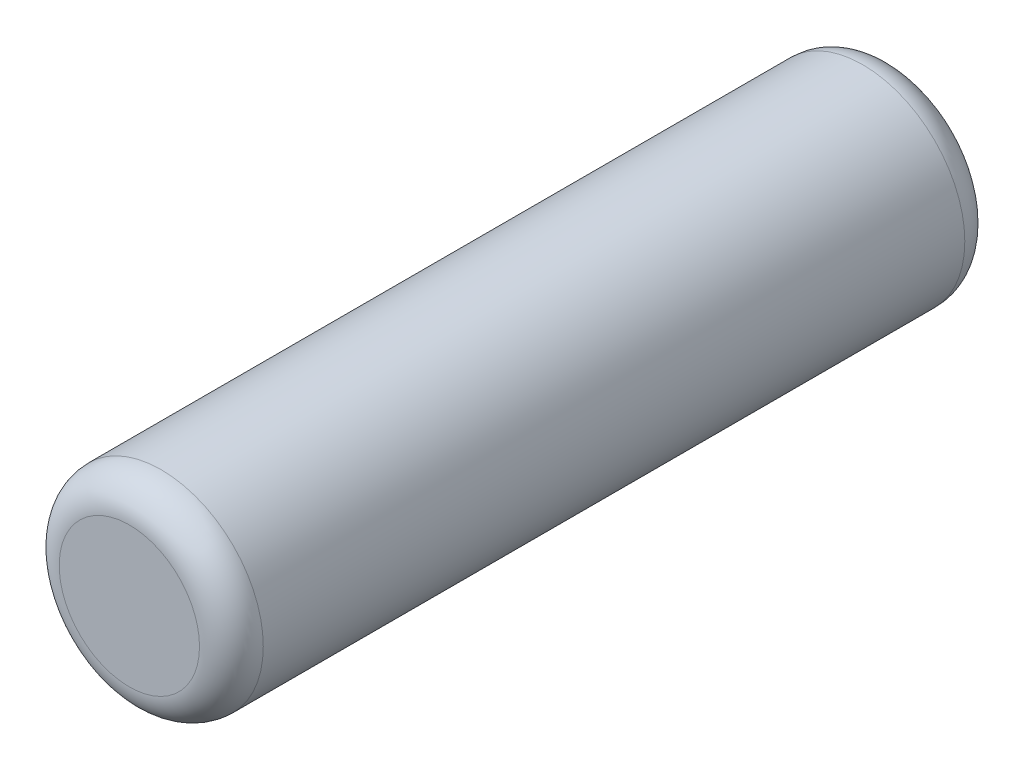
ISO-10303-21;
HEADER;
FILE_DESCRIPTION(('STEP AP214'),'2;1');
FILE_NAME('part.step','',(''),(''),'','','');
FILE_SCHEMA(('AUTOMOTIVE_DESIGN { 1 0 10303 214 1 1 1 1 }'));
ENDSEC;
DATA;
#1=APPLICATION_CONTEXT('core data for automotive mechanical design processes');
#2=APPLICATION_PROTOCOL_DEFINITION('international standard','automotive_design',2000,#1);
#3=PRODUCT_CONTEXT('',#1,'mechanical');
#4=PRODUCT('Part','Part','',(#3));
#5=PRODUCT_RELATED_PRODUCT_CATEGORY('part','',(#4));
#6=PRODUCT_DEFINITION_FORMATION('','',#4);
#7=PRODUCT_DEFINITION_CONTEXT('part definition',#1,'design');
#8=PRODUCT_DEFINITION('design','',#6,#7);
#9=PRODUCT_DEFINITION_SHAPE('','',#8);
#10=(LENGTH_UNIT() NAMED_UNIT(*) SI_UNIT(.MILLI.,.METRE.));
#11=(NAMED_UNIT(*) PLANE_ANGLE_UNIT() SI_UNIT($,.RADIAN.));
#12=(NAMED_UNIT(*) SI_UNIT($,.STERADIAN.) SOLID_ANGLE_UNIT());
#13=UNCERTAINTY_MEASURE_WITH_UNIT(LENGTH_MEASURE(1.E-05),#10,'distance_accuracy_value','');
#14=(GEOMETRIC_REPRESENTATION_CONTEXT(3) GLOBAL_UNCERTAINTY_ASSIGNED_CONTEXT((#13)) GLOBAL_UNIT_ASSIGNED_CONTEXT((#10,
#11,#12)) REPRESENTATION_CONTEXT('',''));
#15=CARTESIAN_POINT('',(0.,0.,0.));
#16=DIRECTION('',(0.,0.,1.));
#17=DIRECTION('',(1.,0.,0.));
#18=AXIS2_PLACEMENT_3D('',#15,#16,#17);
#19=CARTESIAN_POINT('',(0.,0.,24.));
#20=DIRECTION('',(0.,0.,-1.));
#21=DIRECTION('',(-1.,0.,0.));
#22=AXIS2_PLACEMENT_3D('',#19,#20,#21);
#23=CYLINDRICAL_SURFACE('',#22,3.2);
#24=CARTESIAN_POINT('',(0.,0.,1.));
#25=DIRECTION('',(0.,0.,1.));
#26=DIRECTION('',(1.,0.,0.));
#27=AXIS2_PLACEMENT_3D('',#24,#25,#26);
#28=CIRCLE('',#27,3.2);
#29=CARTESIAN_POINT('',(3.2,0.,1.));
#30=VERTEX_POINT('',#29);
#31=EDGE_CURVE('E42',#30,#30,#28,.T.);
#32=ORIENTED_EDGE('',*,*,#31,.T.);
#33=EDGE_LOOP('',(#32));
#34=FACE_BOUND('',#33,.T.);
#35=CARTESIAN_POINT('',(0.,0.,23.));
#36=DIRECTION('',(0.,0.,1.));
#37=DIRECTION('',(1.,0.,0.));
#38=AXIS2_PLACEMENT_3D('',#35,#36,#37);
#39=CIRCLE('',#38,3.2);
#40=CARTESIAN_POINT('',(3.2,0.,23.));
#41=VERTEX_POINT('',#40);
#42=EDGE_CURVE('E46',#41,#41,#39,.F.);
#43=ORIENTED_EDGE('',*,*,#42,.T.);
#44=EDGE_LOOP('',(#43));
#45=FACE_BOUND('',#44,.T.);
#46=ADVANCED_FACE('F31',(#34,#45),#23,.T.);
#47=CARTESIAN_POINT('',(0.,0.,24.));
#48=DIRECTION('',(0.,0.,1.));
#49=DIRECTION('',(1.,0.,0.));
#50=AXIS2_PLACEMENT_3D('',#47,#48,#49);
#51=PLANE('',#50);
#52=CARTESIAN_POINT('',(0.,0.,24.));
#53=DIRECTION('',(0.,0.,1.));
#54=DIRECTION('',(1.,0.,0.));
#55=AXIS2_PLACEMENT_3D('',#52,#53,#54);
#56=CIRCLE('',#55,2.2);
#57=CARTESIAN_POINT('',(2.2,0.,24.));
#58=VERTEX_POINT('',#57);
#59=EDGE_CURVE('E10',#58,#58,#56,.T.);
#60=ORIENTED_EDGE('',*,*,#59,.T.);
#61=EDGE_LOOP('',(#60));
#62=FACE_BOUND('',#61,.T.);
#63=ADVANCED_FACE('F62',(#62),#51,.T.);
#64=CARTESIAN_POINT('',(0.,0.,0.));
#65=DIRECTION('',(0.,0.,1.));
#66=DIRECTION('',(1.,0.,0.));
#67=AXIS2_PLACEMENT_3D('',#64,#65,#66);
#68=PLANE('',#67);
#69=CARTESIAN_POINT('',(0.,0.,0.));
#70=DIRECTION('',(0.,0.,1.));
#71=DIRECTION('',(1.,0.,0.));
#72=AXIS2_PLACEMENT_3D('',#69,#70,#71);
#73=CIRCLE('',#72,2.2);
#74=CARTESIAN_POINT('',(2.2,0.,0.));
#75=VERTEX_POINT('',#74);
#76=EDGE_CURVE('E38',#75,#75,#73,.F.);
#77=ORIENTED_EDGE('',*,*,#76,.T.);
#78=EDGE_LOOP('',(#77));
#79=FACE_BOUND('',#78,.T.);
#80=ADVANCED_FACE('F59',(#79),#68,.F.);
#81=CARTESIAN_POINT('',(0.,0.,1.));
#82=DIRECTION('',(0.,0.,1.));
#83=DIRECTION('',(1.,0.,0.));
#84=AXIS2_PLACEMENT_3D('',#81,#82,#83);
#85=TOROIDAL_SURFACE('',#84,2.2,1.);
#86=ORIENTED_EDGE('',*,*,#76,.F.);
#87=EDGE_LOOP('',(#86));
#88=FACE_BOUND('',#87,.T.);
#89=ORIENTED_EDGE('',*,*,#31,.F.);
#90=EDGE_LOOP('',(#89));
#91=FACE_BOUND('',#90,.T.);
#92=ADVANCED_FACE('F55',(#88,#91),#85,.T.);
#93=CARTESIAN_POINT('',(0.,0.,23.));
#94=DIRECTION('',(0.,0.,1.));
#95=DIRECTION('',(1.,0.,0.));
#96=AXIS2_PLACEMENT_3D('',#93,#94,#95);
#97=TOROIDAL_SURFACE('',#96,2.2,1.);
#98=ORIENTED_EDGE('',*,*,#42,.F.);
#99=EDGE_LOOP('',(#98));
#100=FACE_BOUND('',#99,.T.);
#101=ORIENTED_EDGE('',*,*,#59,.F.);
#102=EDGE_LOOP('',(#101));
#103=FACE_BOUND('',#102,.T.);
#104=ADVANCED_FACE('F33',(#100,#103),#97,.T.);
#105=CLOSED_SHELL('',(#46,#63,#80,#92,#104));
#106=MANIFOLD_SOLID_BREP('B2',#105);
#107=ADVANCED_BREP_SHAPE_REPRESENTATION('',(#18,#106),#14);
#108=SHAPE_DEFINITION_REPRESENTATION(#9,#107);
ENDSEC;
END-ISO-10303-21;
